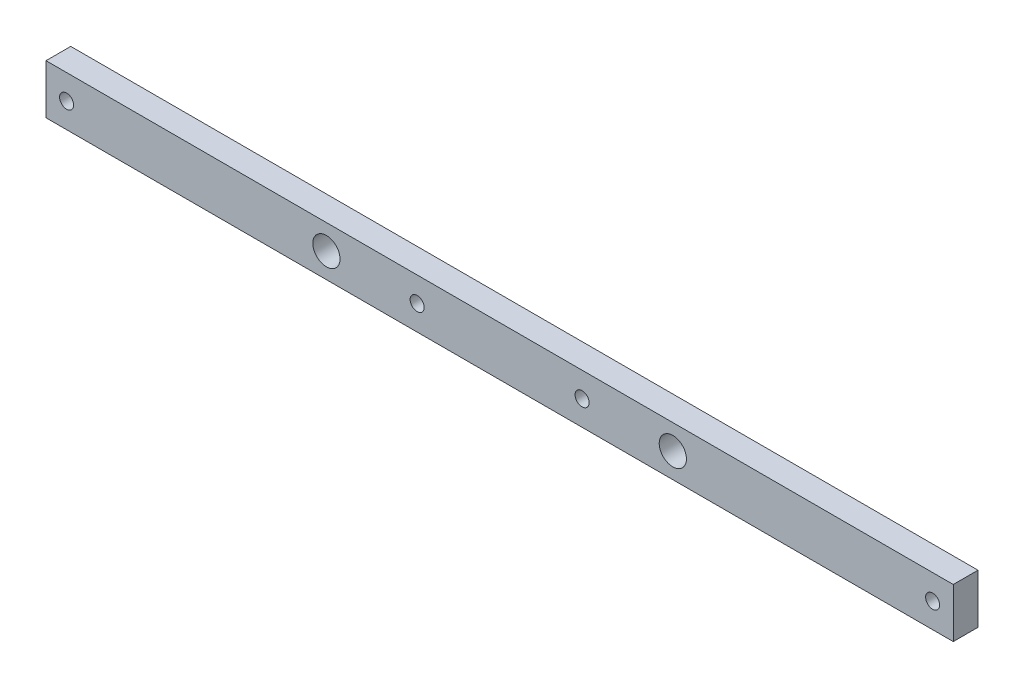
ISO-10303-21;
HEADER;
FILE_DESCRIPTION(('STEP AP214'),'2;1');
FILE_NAME('part.step','',(''),(''),'','','');
FILE_SCHEMA(('AUTOMOTIVE_DESIGN { 1 0 10303 214 1 1 1 1 }'));
ENDSEC;
DATA;
#1=APPLICATION_CONTEXT('core data for automotive mechanical design processes');
#2=APPLICATION_PROTOCOL_DEFINITION('international standard','automotive_design',2000,#1);
#3=PRODUCT_CONTEXT('',#1,'mechanical');
#4=PRODUCT('Part','Part','',(#3));
#5=PRODUCT_RELATED_PRODUCT_CATEGORY('part','',(#4));
#6=PRODUCT_DEFINITION_FORMATION('','',#4);
#7=PRODUCT_DEFINITION_CONTEXT('part definition',#1,'design');
#8=PRODUCT_DEFINITION('design','',#6,#7);
#9=PRODUCT_DEFINITION_SHAPE('','',#8);
#10=(LENGTH_UNIT() NAMED_UNIT(*) SI_UNIT(.MILLI.,.METRE.));
#11=(NAMED_UNIT(*) PLANE_ANGLE_UNIT() SI_UNIT($,.RADIAN.));
#12=(NAMED_UNIT(*) SI_UNIT($,.STERADIAN.) SOLID_ANGLE_UNIT());
#13=UNCERTAINTY_MEASURE_WITH_UNIT(LENGTH_MEASURE(1.E-05),#10,'distance_accuracy_value','');
#14=(GEOMETRIC_REPRESENTATION_CONTEXT(3) GLOBAL_UNCERTAINTY_ASSIGNED_CONTEXT((#13)) GLOBAL_UNIT_ASSIGNED_CONTEXT((#10,
#11,#12)) REPRESENTATION_CONTEXT('',''));
#15=CARTESIAN_POINT('',(0.,0.,0.));
#16=DIRECTION('',(0.,0.,1.));
#17=DIRECTION('',(1.,0.,0.));
#18=AXIS2_PLACEMENT_3D('',#15,#16,#17);
#19=CARTESIAN_POINT('',(0.,0.,6.));
#20=DIRECTION('',(0.,0.,-1.));
#21=DIRECTION('',(-1.,0.,0.));
#22=AXIS2_PLACEMENT_3D('',#19,#20,#21);
#23=PLANE('',#22);
#24=CARTESIAN_POINT('',(-20.,0.,6.));
#25=DIRECTION('',(0.,0.,1.));
#26=DIRECTION('',(1.,0.,0.));
#27=AXIS2_PLACEMENT_3D('',#24,#25,#26);
#28=CIRCLE('',#27,1.7);
#29=CARTESIAN_POINT('',(-18.3,0.,6.));
#30=VERTEX_POINT('',#29);
#31=EDGE_CURVE('E120',#30,#30,#28,.T.);
#32=ORIENTED_EDGE('',*,*,#31,.F.);
#33=EDGE_LOOP('',(#32));
#34=FACE_BOUND('',#33,.T.);
#35=CARTESIAN_POINT('',(20.,0.,6.));
#36=DIRECTION('',(0.,0.,1.));
#37=DIRECTION('',(1.,0.,0.));
#38=AXIS2_PLACEMENT_3D('',#35,#36,#37);
#39=CIRCLE('',#38,1.7);
#40=CARTESIAN_POINT('',(21.7,0.,6.));
#41=VERTEX_POINT('',#40);
#42=EDGE_CURVE('E122',#41,#41,#39,.T.);
#43=ORIENTED_EDGE('',*,*,#42,.F.);
#44=EDGE_LOOP('',(#43));
#45=FACE_BOUND('',#44,.T.);
#46=DIRECTION('',(0.,-1.,0.));
#47=VECTOR('',#46,1.);
#48=CARTESIAN_POINT('',(-110.,-6.,6.));
#49=LINE('',#48,#47);
#50=CARTESIAN_POINT('',(-110.,6.,6.));
#51=VERTEX_POINT('',#50);
#52=CARTESIAN_POINT('',(-110.,-6.,6.));
#53=VERTEX_POINT('',#52);
#54=EDGE_CURVE('E94',#51,#53,#49,.T.);
#55=ORIENTED_EDGE('',*,*,#54,.T.);
#56=DIRECTION('',(1.,0.,0.));
#57=VECTOR('',#56,1.);
#58=CARTESIAN_POINT('',(-110.,-6.,6.));
#59=LINE('',#58,#57);
#60=CARTESIAN_POINT('',(110.,-6.,6.));
#61=VERTEX_POINT('',#60);
#62=EDGE_CURVE('E90',#53,#61,#59,.T.);
#63=ORIENTED_EDGE('',*,*,#62,.T.);
#64=DIRECTION('',(0.,1.,0.));
#65=VECTOR('',#64,1.);
#66=CARTESIAN_POINT('',(110.,-6.,6.));
#67=LINE('',#66,#65);
#68=CARTESIAN_POINT('',(110.,6.,6.));
#69=VERTEX_POINT('',#68);
#70=EDGE_CURVE('E95',#61,#69,#67,.T.);
#71=ORIENTED_EDGE('',*,*,#70,.T.);
#72=DIRECTION('',(-1.,0.,0.));
#73=VECTOR('',#72,1.);
#74=CARTESIAN_POINT('',(-110.,6.,6.));
#75=LINE('',#74,#73);
#76=EDGE_CURVE('E56',#69,#51,#75,.T.);
#77=ORIENTED_EDGE('',*,*,#76,.T.);
#78=EDGE_LOOP('',(#55,#63,#71,#77));
#79=FACE_BOUND('',#78,.T.);
#80=CARTESIAN_POINT('',(-105.,0.,6.));
#81=DIRECTION('',(0.,0.,1.));
#82=DIRECTION('',(1.,0.,0.));
#83=AXIS2_PLACEMENT_3D('',#80,#81,#82);
#84=CIRCLE('',#83,1.69999999999999);
#85=CARTESIAN_POINT('',(-103.3,0.,6.));
#86=VERTEX_POINT('',#85);
#87=EDGE_CURVE('E109',#86,#86,#84,.T.);
#88=ORIENTED_EDGE('',*,*,#87,.F.);
#89=EDGE_LOOP('',(#88));
#90=FACE_BOUND('',#89,.T.);
#91=CARTESIAN_POINT('',(105.,0.,6.));
#92=DIRECTION('',(0.,0.,1.));
#93=DIRECTION('',(1.,0.,0.));
#94=AXIS2_PLACEMENT_3D('',#91,#92,#93);
#95=CIRCLE('',#94,1.69999999999999);
#96=CARTESIAN_POINT('',(106.7,0.,6.));
#97=VERTEX_POINT('',#96);
#98=EDGE_CURVE('E142',#97,#97,#95,.T.);
#99=ORIENTED_EDGE('',*,*,#98,.F.);
#100=EDGE_LOOP('',(#99));
#101=FACE_BOUND('',#100,.T.);
#102=CARTESIAN_POINT('',(-42.,0.,6.));
#103=DIRECTION('',(0.,0.,1.));
#104=DIRECTION('',(1.,0.,0.));
#105=AXIS2_PLACEMENT_3D('',#102,#103,#104);
#106=CIRCLE('',#105,3.3);
#107=CARTESIAN_POINT('',(-38.7,0.,6.));
#108=VERTEX_POINT('',#107);
#109=EDGE_CURVE('E139',#108,#108,#106,.T.);
#110=ORIENTED_EDGE('',*,*,#109,.F.);
#111=EDGE_LOOP('',(#110));
#112=FACE_BOUND('',#111,.T.);
#113=CARTESIAN_POINT('',(42.,0.,6.));
#114=DIRECTION('',(0.,0.,1.));
#115=DIRECTION('',(1.,0.,0.));
#116=AXIS2_PLACEMENT_3D('',#113,#114,#115);
#117=CIRCLE('',#116,3.3);
#118=CARTESIAN_POINT('',(45.3,0.,6.));
#119=VERTEX_POINT('',#118);
#120=EDGE_CURVE('E128',#119,#119,#117,.T.);
#121=ORIENTED_EDGE('',*,*,#120,.F.);
#122=EDGE_LOOP('',(#121));
#123=FACE_BOUND('',#122,.T.);
#124=ADVANCED_FACE('F37',(#34,#45,#79,#90,#101,#112,#123),#23,.F.);
#125=CARTESIAN_POINT('',(0.,0.,0.));
#126=DIRECTION('',(0.,0.,-1.));
#127=DIRECTION('',(-1.,0.,0.));
#128=AXIS2_PLACEMENT_3D('',#125,#126,#127);
#129=PLANE('',#128);
#130=CARTESIAN_POINT('',(-20.,0.,0.));
#131=DIRECTION('',(0.,0.,-1.));
#132=DIRECTION('',(-1.,0.,0.));
#133=AXIS2_PLACEMENT_3D('',#130,#131,#132);
#134=CIRCLE('',#133,1.7);
#135=CARTESIAN_POINT('',(-18.3,0.,0.));
#136=VERTEX_POINT('',#135);
#137=EDGE_CURVE('E42',#136,#136,#134,.T.);
#138=ORIENTED_EDGE('',*,*,#137,.F.);
#139=EDGE_LOOP('',(#138));
#140=FACE_BOUND('',#139,.T.);
#141=CARTESIAN_POINT('',(20.,0.,0.));
#142=DIRECTION('',(0.,0.,-1.));
#143=DIRECTION('',(-1.,0.,0.));
#144=AXIS2_PLACEMENT_3D('',#141,#142,#143);
#145=CIRCLE('',#144,1.7);
#146=CARTESIAN_POINT('',(21.7,0.,0.));
#147=VERTEX_POINT('',#146);
#148=EDGE_CURVE('E113',#147,#147,#145,.T.);
#149=ORIENTED_EDGE('',*,*,#148,.F.);
#150=EDGE_LOOP('',(#149));
#151=FACE_BOUND('',#150,.T.);
#152=CARTESIAN_POINT('',(-42.,0.,0.));
#153=DIRECTION('',(0.,0.,1.));
#154=DIRECTION('',(1.,0.,0.));
#155=AXIS2_PLACEMENT_3D('',#152,#153,#154);
#156=CIRCLE('',#155,3.3);
#157=CARTESIAN_POINT('',(-38.7,0.,0.));
#158=VERTEX_POINT('',#157);
#159=EDGE_CURVE('E134',#158,#158,#156,.T.);
#160=ORIENTED_EDGE('',*,*,#159,.T.);
#161=EDGE_LOOP('',(#160));
#162=FACE_BOUND('',#161,.T.);
#163=CARTESIAN_POINT('',(-105.,0.,0.));
#164=DIRECTION('',(0.,0.,1.));
#165=DIRECTION('',(1.,0.,0.));
#166=AXIS2_PLACEMENT_3D('',#163,#164,#165);
#167=CIRCLE('',#166,1.69999999999999);
#168=CARTESIAN_POINT('',(-103.3,0.,0.));
#169=VERTEX_POINT('',#168);
#170=EDGE_CURVE('E144',#169,#169,#167,.T.);
#171=ORIENTED_EDGE('',*,*,#170,.T.);
#172=EDGE_LOOP('',(#171));
#173=FACE_BOUND('',#172,.T.);
#174=DIRECTION('',(0.,-1.,0.));
#175=VECTOR('',#174,1.);
#176=CARTESIAN_POINT('',(-110.,-6.,0.));
#177=LINE('',#176,#175);
#178=CARTESIAN_POINT('',(-110.,6.,0.));
#179=VERTEX_POINT('',#178);
#180=CARTESIAN_POINT('',(-110.,-6.,0.));
#181=VERTEX_POINT('',#180);
#182=EDGE_CURVE('E110',#179,#181,#177,.T.);
#183=ORIENTED_EDGE('',*,*,#182,.F.);
#184=DIRECTION('',(-1.,0.,0.));
#185=VECTOR('',#184,1.);
#186=CARTESIAN_POINT('',(-110.,6.,0.));
#187=LINE('',#186,#185);
#188=CARTESIAN_POINT('',(110.,6.,0.));
#189=VERTEX_POINT('',#188);
#190=EDGE_CURVE('E81',#189,#179,#187,.T.);
#191=ORIENTED_EDGE('',*,*,#190,.F.);
#192=DIRECTION('',(0.,1.,0.));
#193=VECTOR('',#192,1.);
#194=CARTESIAN_POINT('',(110.,-6.,0.));
#195=LINE('',#194,#193);
#196=CARTESIAN_POINT('',(110.,-6.,0.));
#197=VERTEX_POINT('',#196);
#198=EDGE_CURVE('E77',#197,#189,#195,.T.);
#199=ORIENTED_EDGE('',*,*,#198,.F.);
#200=DIRECTION('',(1.,0.,0.));
#201=VECTOR('',#200,1.);
#202=CARTESIAN_POINT('',(-110.,-6.,0.));
#203=LINE('',#202,#201);
#204=EDGE_CURVE('E98',#181,#197,#203,.T.);
#205=ORIENTED_EDGE('',*,*,#204,.F.);
#206=EDGE_LOOP('',(#183,#191,#199,#205));
#207=FACE_BOUND('',#206,.T.);
#208=CARTESIAN_POINT('',(105.,0.,0.));
#209=DIRECTION('',(0.,0.,1.));
#210=DIRECTION('',(1.,0.,0.));
#211=AXIS2_PLACEMENT_3D('',#208,#209,#210);
#212=CIRCLE('',#211,1.69999999999999);
#213=CARTESIAN_POINT('',(106.7,0.,0.));
#214=VERTEX_POINT('',#213);
#215=EDGE_CURVE('E138',#214,#214,#212,.T.);
#216=ORIENTED_EDGE('',*,*,#215,.T.);
#217=EDGE_LOOP('',(#216));
#218=FACE_BOUND('',#217,.T.);
#219=CARTESIAN_POINT('',(42.,0.,0.));
#220=DIRECTION('',(0.,0.,1.));
#221=DIRECTION('',(1.,0.,0.));
#222=AXIS2_PLACEMENT_3D('',#219,#220,#221);
#223=CIRCLE('',#222,3.3);
#224=CARTESIAN_POINT('',(45.3,0.,0.));
#225=VERTEX_POINT('',#224);
#226=EDGE_CURVE('E121',#225,#225,#223,.T.);
#227=ORIENTED_EDGE('',*,*,#226,.T.);
#228=EDGE_LOOP('',(#227));
#229=FACE_BOUND('',#228,.T.);
#230=ADVANCED_FACE('F153',(#140,#151,#162,#173,#207,#218,#229),#129,.T.);
#231=CARTESIAN_POINT('',(-110.,-6.,6.));
#232=DIRECTION('',(1.,0.,0.));
#233=DIRECTION('',(0.,0.,-1.));
#234=AXIS2_PLACEMENT_3D('',#231,#232,#233);
#235=PLANE('',#234);
#236=ORIENTED_EDGE('',*,*,#182,.T.);
#237=DIRECTION('',(0.,0.,-1.));
#238=VECTOR('',#237,1.);
#239=CARTESIAN_POINT('',(-110.,-6.,6.));
#240=LINE('',#239,#238);
#241=EDGE_CURVE('E11',#53,#181,#240,.T.);
#242=ORIENTED_EDGE('',*,*,#241,.F.);
#243=ORIENTED_EDGE('',*,*,#54,.F.);
#244=DIRECTION('',(0.,0.,-1.));
#245=VECTOR('',#244,1.);
#246=CARTESIAN_POINT('',(-110.,6.,6.));
#247=LINE('',#246,#245);
#248=EDGE_CURVE('E103',#51,#179,#247,.T.);
#249=ORIENTED_EDGE('',*,*,#248,.T.);
#250=EDGE_LOOP('',(#236,#242,#243,#249));
#251=FACE_BOUND('',#250,.T.);
#252=ADVANCED_FACE('F45',(#251),#235,.F.);
#253=CARTESIAN_POINT('',(-110.,-6.,6.));
#254=DIRECTION('',(0.,1.,0.));
#255=DIRECTION('',(0.,0.,1.));
#256=AXIS2_PLACEMENT_3D('',#253,#254,#255);
#257=PLANE('',#256);
#258=ORIENTED_EDGE('',*,*,#204,.T.);
#259=DIRECTION('',(0.,0.,-1.));
#260=VECTOR('',#259,1.);
#261=CARTESIAN_POINT('',(110.,-6.,6.));
#262=LINE('',#261,#260);
#263=EDGE_CURVE('E49',#61,#197,#262,.T.);
#264=ORIENTED_EDGE('',*,*,#263,.F.);
#265=ORIENTED_EDGE('',*,*,#62,.F.);
#266=ORIENTED_EDGE('',*,*,#241,.T.);
#267=EDGE_LOOP('',(#258,#264,#265,#266));
#268=FACE_BOUND('',#267,.T.);
#269=ADVANCED_FACE('F100',(#268),#257,.F.);
#270=CARTESIAN_POINT('',(110.,-6.,6.));
#271=DIRECTION('',(-1.,0.,0.));
#272=DIRECTION('',(0.,0.,1.));
#273=AXIS2_PLACEMENT_3D('',#270,#271,#272);
#274=PLANE('',#273);
#275=ORIENTED_EDGE('',*,*,#198,.T.);
#276=DIRECTION('',(0.,0.,-1.));
#277=VECTOR('',#276,1.);
#278=CARTESIAN_POINT('',(110.,6.,6.));
#279=LINE('',#278,#277);
#280=EDGE_CURVE('E97',#69,#189,#279,.T.);
#281=ORIENTED_EDGE('',*,*,#280,.F.);
#282=ORIENTED_EDGE('',*,*,#70,.F.);
#283=ORIENTED_EDGE('',*,*,#263,.T.);
#284=EDGE_LOOP('',(#275,#281,#282,#283));
#285=FACE_BOUND('',#284,.T.);
#286=ADVANCED_FACE('F101',(#285),#274,.F.);
#287=CARTESIAN_POINT('',(-110.,6.,6.));
#288=DIRECTION('',(0.,-1.,0.));
#289=DIRECTION('',(0.,0.,-1.));
#290=AXIS2_PLACEMENT_3D('',#287,#288,#289);
#291=PLANE('',#290);
#292=ORIENTED_EDGE('',*,*,#190,.T.);
#293=ORIENTED_EDGE('',*,*,#248,.F.);
#294=ORIENTED_EDGE('',*,*,#76,.F.);
#295=ORIENTED_EDGE('',*,*,#280,.T.);
#296=EDGE_LOOP('',(#292,#293,#294,#295));
#297=FACE_BOUND('',#296,.T.);
#298=ADVANCED_FACE('F157',(#297),#291,.F.);
#299=CARTESIAN_POINT('',(-105.,0.,6.));
#300=DIRECTION('',(0.,0.,-1.));
#301=DIRECTION('',(-1.,0.,0.));
#302=AXIS2_PLACEMENT_3D('',#299,#300,#301);
#303=CYLINDRICAL_SURFACE('',#302,1.69999999999999);
#304=ORIENTED_EDGE('',*,*,#87,.T.);
#305=EDGE_LOOP('',(#304));
#306=FACE_BOUND('',#305,.T.);
#307=ORIENTED_EDGE('',*,*,#170,.F.);
#308=EDGE_LOOP('',(#307));
#309=FACE_BOUND('',#308,.T.);
#310=ADVANCED_FACE('F156',(#306,#309),#303,.F.);
#311=CARTESIAN_POINT('',(105.,0.,6.));
#312=DIRECTION('',(0.,0.,-1.));
#313=DIRECTION('',(-1.,0.,0.));
#314=AXIS2_PLACEMENT_3D('',#311,#312,#313);
#315=CYLINDRICAL_SURFACE('',#314,1.69999999999999);
#316=ORIENTED_EDGE('',*,*,#98,.T.);
#317=EDGE_LOOP('',(#316));
#318=FACE_BOUND('',#317,.T.);
#319=ORIENTED_EDGE('',*,*,#215,.F.);
#320=EDGE_LOOP('',(#319));
#321=FACE_BOUND('',#320,.T.);
#322=ADVANCED_FACE('F158',(#318,#321),#315,.F.);
#323=CARTESIAN_POINT('',(-42.,0.,6.));
#324=DIRECTION('',(0.,0.,-1.));
#325=DIRECTION('',(-1.,0.,0.));
#326=AXIS2_PLACEMENT_3D('',#323,#324,#325);
#327=CYLINDRICAL_SURFACE('',#326,3.3);
#328=ORIENTED_EDGE('',*,*,#109,.T.);
#329=EDGE_LOOP('',(#328));
#330=FACE_BOUND('',#329,.T.);
#331=ORIENTED_EDGE('',*,*,#159,.F.);
#332=EDGE_LOOP('',(#331));
#333=FACE_BOUND('',#332,.T.);
#334=ADVANCED_FACE('F167',(#330,#333),#327,.F.);
#335=CARTESIAN_POINT('',(42.,0.,6.));
#336=DIRECTION('',(0.,0.,-1.));
#337=DIRECTION('',(-1.,0.,0.));
#338=AXIS2_PLACEMENT_3D('',#335,#336,#337);
#339=CYLINDRICAL_SURFACE('',#338,3.3);
#340=ORIENTED_EDGE('',*,*,#120,.T.);
#341=EDGE_LOOP('',(#340));
#342=FACE_BOUND('',#341,.T.);
#343=ORIENTED_EDGE('',*,*,#226,.F.);
#344=EDGE_LOOP('',(#343));
#345=FACE_BOUND('',#344,.T.);
#346=ADVANCED_FACE('F192',(#342,#345),#339,.F.);
#347=CARTESIAN_POINT('',(20.,0.,-0.5));
#348=DIRECTION('',(0.,0.,1.));
#349=DIRECTION('',(1.,0.,0.));
#350=AXIS2_PLACEMENT_3D('',#347,#348,#349);
#351=CYLINDRICAL_SURFACE('',#350,1.7);
#352=CARTESIAN_POINT('',(21.7,0.,0.));
#353=CARTESIAN_POINT('',(21.7,0.,0.0625000000000002));
#354=CARTESIAN_POINT('',(21.7,0.,0.125));
#355=CARTESIAN_POINT('',(21.7,0.,0.25));
#356=CARTESIAN_POINT('',(21.7,0.,0.3125));
#357=CARTESIAN_POINT('',(21.7,0.,0.4375));
#358=CARTESIAN_POINT('',(21.7,0.,0.5));
#359=CARTESIAN_POINT('',(21.7,0.,0.625));
#360=CARTESIAN_POINT('',(21.7,0.,0.6875));
#361=CARTESIAN_POINT('',(21.7,0.,0.8125));
#362=CARTESIAN_POINT('',(21.7,0.,0.875));
#363=CARTESIAN_POINT('',(21.7,0.,1.));
#364=CARTESIAN_POINT('',(21.7,0.,1.0625));
#365=CARTESIAN_POINT('',(21.7,0.,1.1875));
#366=CARTESIAN_POINT('',(21.7,0.,1.25));
#367=CARTESIAN_POINT('',(21.7,0.,1.375));
#368=CARTESIAN_POINT('',(21.7,0.,1.4375));
#369=CARTESIAN_POINT('',(21.7,0.,1.5625));
#370=CARTESIAN_POINT('',(21.7,0.,1.625));
#371=CARTESIAN_POINT('',(21.7,0.,1.75));
#372=CARTESIAN_POINT('',(21.7,0.,1.8125));
#373=CARTESIAN_POINT('',(21.7,0.,1.9375));
#374=CARTESIAN_POINT('',(21.7,0.,2.));
#375=CARTESIAN_POINT('',(21.7,0.,2.125));
#376=CARTESIAN_POINT('',(21.7,0.,2.1875));
#377=CARTESIAN_POINT('',(21.7,0.,2.3125));
#378=CARTESIAN_POINT('',(21.7,0.,2.375));
#379=CARTESIAN_POINT('',(21.7,0.,2.5));
#380=CARTESIAN_POINT('',(21.7,0.,2.5625));
#381=CARTESIAN_POINT('',(21.7,0.,2.6875));
#382=CARTESIAN_POINT('',(21.7,0.,2.75));
#383=CARTESIAN_POINT('',(21.7,0.,2.875));
#384=CARTESIAN_POINT('',(21.7,0.,2.9375));
#385=CARTESIAN_POINT('',(21.7,0.,3.0625));
#386=CARTESIAN_POINT('',(21.7,0.,3.125));
#387=CARTESIAN_POINT('',(21.7,0.,3.25));
#388=CARTESIAN_POINT('',(21.7,0.,3.3125));
#389=CARTESIAN_POINT('',(21.7,0.,3.4375));
#390=CARTESIAN_POINT('',(21.7,0.,3.5));
#391=CARTESIAN_POINT('',(21.7,0.,3.625));
#392=CARTESIAN_POINT('',(21.7,0.,3.6875));
#393=CARTESIAN_POINT('',(21.7,0.,3.8125));
#394=CARTESIAN_POINT('',(21.7,0.,3.875));
#395=CARTESIAN_POINT('',(21.7,0.,4.));
#396=CARTESIAN_POINT('',(21.7,0.,4.0625));
#397=CARTESIAN_POINT('',(21.7,0.,4.1875));
#398=CARTESIAN_POINT('',(21.7,0.,4.25));
#399=CARTESIAN_POINT('',(21.7,0.,4.375));
#400=CARTESIAN_POINT('',(21.7,0.,4.4375));
#401=CARTESIAN_POINT('',(21.7,0.,4.5625));
#402=CARTESIAN_POINT('',(21.7,0.,4.625));
#403=CARTESIAN_POINT('',(21.7,0.,4.75));
#404=CARTESIAN_POINT('',(21.7,0.,4.8125));
#405=CARTESIAN_POINT('',(21.7,0.,4.9375));
#406=CARTESIAN_POINT('',(21.7,0.,5.));
#407=CARTESIAN_POINT('',(21.7,0.,5.125));
#408=CARTESIAN_POINT('',(21.7,0.,5.1875));
#409=CARTESIAN_POINT('',(21.7,0.,5.3125));
#410=CARTESIAN_POINT('',(21.7,0.,5.375));
#411=CARTESIAN_POINT('',(21.7,0.,5.5));
#412=CARTESIAN_POINT('',(21.7,0.,5.5625));
#413=CARTESIAN_POINT('',(21.7,0.,5.6875));
#414=CARTESIAN_POINT('',(21.7,0.,5.75));
#415=CARTESIAN_POINT('',(21.7,0.,5.875));
#416=CARTESIAN_POINT('',(21.7,0.,5.9375));
#417=CARTESIAN_POINT('',(21.7,0.,6.));
#418=B_SPLINE_CURVE_WITH_KNOTS('',3,(#352,#353,#354,#355,#356,#357,#358,#359,#360,#361,#362,
#363,#364,#365,#366,#367,#368,#369,#370,#371,#372,#373,#374,#375,#376,#377,#378,#379,#380,#381,
#382,#383,#384,#385,#386,#387,#388,#389,#390,#391,#392,#393,#394,#395,#396,#397,#398,#399,#400,
#401,#402,#403,#404,#405,#406,#407,#408,#409,#410,#411,#412,#413,#414,#415,#416,#417),
.UNSPECIFIED.,.F.,.F.,(4,2,2,2,2,2,2,2,2,2,2,2,2,2,2,2,2,2,2,2,2,2,2,2,2,2,2,2,2,2,2,2,4),(0.,
0.1875,0.375,0.5625,0.75,0.9375,1.125,1.3125,1.5,1.6875,1.875,2.0625,2.25,2.4375,2.625,2.8125,
3.,3.1875,3.375,3.5625,3.75,3.9375,4.125,4.3125,4.5,4.6875,4.875,5.0625,5.25,5.4375,5.625,
5.8125,6.),.UNSPECIFIED.);
#419=EDGE_CURVE('BSEAM198',#147,#41,#418,.T.);
#420=ORIENTED_EDGE('',*,*,#148,.T.);
#421=ORIENTED_EDGE('',*,*,#42,.T.);
#422=ORIENTED_EDGE('',*,*,#419,.T.);
#423=ORIENTED_EDGE('',*,*,#419,.F.);
#424=EDGE_LOOP('',(#420,#422,#421,#423));
#425=FACE_BOUND('',#424,.T.);
#426=ADVANCED_FACE('F198',(#425),#351,.F.);
#427=CARTESIAN_POINT('',(-20.,0.,-0.5));
#428=DIRECTION('',(0.,0.,1.));
#429=DIRECTION('',(1.,0.,0.));
#430=AXIS2_PLACEMENT_3D('',#427,#428,#429);
#431=CYLINDRICAL_SURFACE('',#430,1.7);
#432=CARTESIAN_POINT('',(-18.3,0.,0.));
#433=CARTESIAN_POINT('',(-18.3,0.,0.0625000000000002));
#434=CARTESIAN_POINT('',(-18.3,0.,0.125));
#435=CARTESIAN_POINT('',(-18.3,0.,0.25));
#436=CARTESIAN_POINT('',(-18.3,0.,0.3125));
#437=CARTESIAN_POINT('',(-18.3,0.,0.4375));
#438=CARTESIAN_POINT('',(-18.3,0.,0.5));
#439=CARTESIAN_POINT('',(-18.3,0.,0.625));
#440=CARTESIAN_POINT('',(-18.3,0.,0.6875));
#441=CARTESIAN_POINT('',(-18.3,0.,0.8125));
#442=CARTESIAN_POINT('',(-18.3,0.,0.875));
#443=CARTESIAN_POINT('',(-18.3,0.,1.));
#444=CARTESIAN_POINT('',(-18.3,0.,1.0625));
#445=CARTESIAN_POINT('',(-18.3,0.,1.1875));
#446=CARTESIAN_POINT('',(-18.3,0.,1.25));
#447=CARTESIAN_POINT('',(-18.3,0.,1.375));
#448=CARTESIAN_POINT('',(-18.3,0.,1.4375));
#449=CARTESIAN_POINT('',(-18.3,0.,1.5625));
#450=CARTESIAN_POINT('',(-18.3,0.,1.625));
#451=CARTESIAN_POINT('',(-18.3,0.,1.75));
#452=CARTESIAN_POINT('',(-18.3,0.,1.8125));
#453=CARTESIAN_POINT('',(-18.3,0.,1.9375));
#454=CARTESIAN_POINT('',(-18.3,0.,2.));
#455=CARTESIAN_POINT('',(-18.3,0.,2.125));
#456=CARTESIAN_POINT('',(-18.3,0.,2.1875));
#457=CARTESIAN_POINT('',(-18.3,0.,2.3125));
#458=CARTESIAN_POINT('',(-18.3,0.,2.375));
#459=CARTESIAN_POINT('',(-18.3,0.,2.5));
#460=CARTESIAN_POINT('',(-18.3,0.,2.5625));
#461=CARTESIAN_POINT('',(-18.3,0.,2.6875));
#462=CARTESIAN_POINT('',(-18.3,0.,2.75));
#463=CARTESIAN_POINT('',(-18.3,0.,2.875));
#464=CARTESIAN_POINT('',(-18.3,0.,2.9375));
#465=CARTESIAN_POINT('',(-18.3,0.,3.0625));
#466=CARTESIAN_POINT('',(-18.3,0.,3.125));
#467=CARTESIAN_POINT('',(-18.3,0.,3.25));
#468=CARTESIAN_POINT('',(-18.3,0.,3.3125));
#469=CARTESIAN_POINT('',(-18.3,0.,3.4375));
#470=CARTESIAN_POINT('',(-18.3,0.,3.5));
#471=CARTESIAN_POINT('',(-18.3,0.,3.625));
#472=CARTESIAN_POINT('',(-18.3,0.,3.6875));
#473=CARTESIAN_POINT('',(-18.3,0.,3.8125));
#474=CARTESIAN_POINT('',(-18.3,0.,3.875));
#475=CARTESIAN_POINT('',(-18.3,0.,4.));
#476=CARTESIAN_POINT('',(-18.3,0.,4.0625));
#477=CARTESIAN_POINT('',(-18.3,0.,4.1875));
#478=CARTESIAN_POINT('',(-18.3,0.,4.25));
#479=CARTESIAN_POINT('',(-18.3,0.,4.375));
#480=CARTESIAN_POINT('',(-18.3,0.,4.4375));
#481=CARTESIAN_POINT('',(-18.3,0.,4.5625));
#482=CARTESIAN_POINT('',(-18.3,0.,4.625));
#483=CARTESIAN_POINT('',(-18.3,0.,4.75));
#484=CARTESIAN_POINT('',(-18.3,0.,4.8125));
#485=CARTESIAN_POINT('',(-18.3,0.,4.9375));
#486=CARTESIAN_POINT('',(-18.3,0.,5.));
#487=CARTESIAN_POINT('',(-18.3,0.,5.125));
#488=CARTESIAN_POINT('',(-18.3,0.,5.1875));
#489=CARTESIAN_POINT('',(-18.3,0.,5.3125));
#490=CARTESIAN_POINT('',(-18.3,0.,5.375));
#491=CARTESIAN_POINT('',(-18.3,0.,5.5));
#492=CARTESIAN_POINT('',(-18.3,0.,5.5625));
#493=CARTESIAN_POINT('',(-18.3,0.,5.6875));
#494=CARTESIAN_POINT('',(-18.3,0.,5.75));
#495=CARTESIAN_POINT('',(-18.3,0.,5.875));
#496=CARTESIAN_POINT('',(-18.3,0.,5.9375));
#497=CARTESIAN_POINT('',(-18.3,0.,6.));
#498=B_SPLINE_CURVE_WITH_KNOTS('',3,(#432,#433,#434,#435,#436,#437,#438,#439,#440,#441,#442,
#443,#444,#445,#446,#447,#448,#449,#450,#451,#452,#453,#454,#455,#456,#457,#458,#459,#460,#461,
#462,#463,#464,#465,#466,#467,#468,#469,#470,#471,#472,#473,#474,#475,#476,#477,#478,#479,#480,
#481,#482,#483,#484,#485,#486,#487,#488,#489,#490,#491,#492,#493,#494,#495,#496,#497),
.UNSPECIFIED.,.F.,.F.,(4,2,2,2,2,2,2,2,2,2,2,2,2,2,2,2,2,2,2,2,2,2,2,2,2,2,2,2,2,2,2,2,4),(0.,
0.1875,0.375,0.5625,0.75,0.9375,1.125,1.3125,1.5,1.6875,1.875,2.0625,2.25,2.4375,2.625,2.8125,
3.,3.1875,3.375,3.5625,3.75,3.9375,4.125,4.3125,4.5,4.6875,4.875,5.0625,5.25,5.4375,5.625,
5.8125,6.),.UNSPECIFIED.);
#499=EDGE_CURVE('BSEAM201',#136,#30,#498,.T.);
#500=ORIENTED_EDGE('',*,*,#137,.T.);
#501=ORIENTED_EDGE('',*,*,#31,.T.);
#502=ORIENTED_EDGE('',*,*,#499,.T.);
#503=ORIENTED_EDGE('',*,*,#499,.F.);
#504=EDGE_LOOP('',(#500,#502,#501,#503));
#505=FACE_BOUND('',#504,.T.);
#506=ADVANCED_FACE('F201',(#505),#431,.F.);
#507=CLOSED_SHELL('',(#124,#230,#252,#269,#286,#298,#310,#322,#334,#346,#426,#506));
#508=MANIFOLD_SOLID_BREP('B2',#507);
#509=ADVANCED_BREP_SHAPE_REPRESENTATION('',(#18,#508),#14);
#510=SHAPE_DEFINITION_REPRESENTATION(#9,#509);
ENDSEC;
END-ISO-10303-21;
